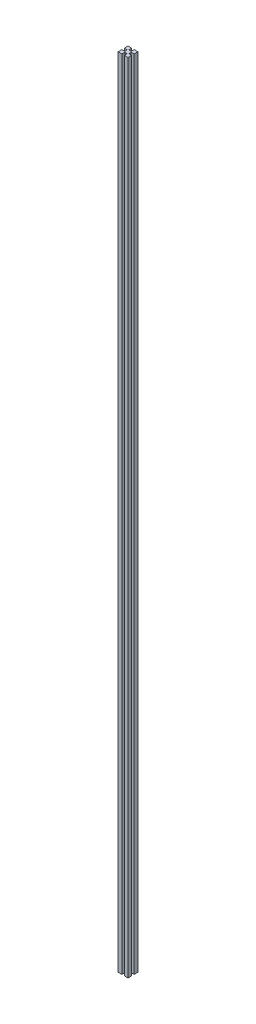
ISO-10303-21;
HEADER;
FILE_DESCRIPTION(('STEP AP214'),'2;1');
FILE_NAME('part.step','',(''),(''),'','','');
FILE_SCHEMA(('AUTOMOTIVE_DESIGN { 1 0 10303 214 1 1 1 1 }'));
ENDSEC;
DATA;
#1=APPLICATION_CONTEXT('core data for automotive mechanical design processes');
#2=APPLICATION_PROTOCOL_DEFINITION('international standard','automotive_design',2000,#1);
#3=PRODUCT_CONTEXT('',#1,'mechanical');
#4=PRODUCT('Part','Part','',(#3));
#5=PRODUCT_RELATED_PRODUCT_CATEGORY('part','',(#4));
#6=PRODUCT_DEFINITION_FORMATION('','',#4);
#7=PRODUCT_DEFINITION_CONTEXT('part definition',#1,'design');
#8=PRODUCT_DEFINITION('design','',#6,#7);
#9=PRODUCT_DEFINITION_SHAPE('','',#8);
#10=(LENGTH_UNIT() NAMED_UNIT(*) SI_UNIT(.MILLI.,.METRE.));
#11=(NAMED_UNIT(*) PLANE_ANGLE_UNIT() SI_UNIT($,.RADIAN.));
#12=(NAMED_UNIT(*) SI_UNIT($,.STERADIAN.) SOLID_ANGLE_UNIT());
#13=UNCERTAINTY_MEASURE_WITH_UNIT(LENGTH_MEASURE(1.E-05),#10,'distance_accuracy_value','');
#14=(GEOMETRIC_REPRESENTATION_CONTEXT(3) GLOBAL_UNCERTAINTY_ASSIGNED_CONTEXT((#13)) GLOBAL_UNIT_ASSIGNED_CONTEXT((#10,
#11,#12)) REPRESENTATION_CONTEXT('',''));
#15=CARTESIAN_POINT('',(0.,0.,0.));
#16=DIRECTION('',(0.,0.,1.));
#17=DIRECTION('',(1.,0.,0.));
#18=AXIS2_PLACEMENT_3D('',#15,#16,#17);
#19=CARTESIAN_POINT('',(10.,-800.1,10.));
#20=DIRECTION('',(1.,0.,0.));
#21=DIRECTION('',(0.,0.,-1.));
#22=AXIS2_PLACEMENT_3D('',#19,#20,#21);
#23=PLANE('',#22);
#24=DIRECTION('',(0.,-1.,0.));
#25=VECTOR('',#24,1.);
#26=CARTESIAN_POINT('',(10.,-800.1,2.5));
#27=LINE('',#26,#25);
#28=CARTESIAN_POINT('',(10.,800.1,2.5));
#29=VERTEX_POINT('',#28);
#30=CARTESIAN_POINT('',(10.,-800.1,2.5));
#31=VERTEX_POINT('',#30);
#32=EDGE_CURVE('E263',#29,#31,#27,.T.);
#33=ORIENTED_EDGE('',*,*,#32,.F.);
#34=DIRECTION('',(0.,0.,-1.));
#35=VECTOR('',#34,1.);
#36=CARTESIAN_POINT('',(10.,800.1,10.));
#37=LINE('',#36,#35);
#38=CARTESIAN_POINT('',(10.,800.1,10.));
#39=VERTEX_POINT('',#38);
#40=EDGE_CURVE('E269',#39,#29,#37,.T.);
#41=ORIENTED_EDGE('',*,*,#40,.F.);
#42=DIRECTION('',(0.,1.,0.));
#43=VECTOR('',#42,1.);
#44=CARTESIAN_POINT('',(10.,-800.1,10.));
#45=LINE('',#44,#43);
#46=CARTESIAN_POINT('',(10.,-800.1,10.));
#47=VERTEX_POINT('',#46);
#48=EDGE_CURVE('E300',#47,#39,#45,.T.);
#49=ORIENTED_EDGE('',*,*,#48,.F.);
#50=DIRECTION('',(0.,0.,-1.));
#51=VECTOR('',#50,1.);
#52=CARTESIAN_POINT('',(10.,-800.1,10.));
#53=LINE('',#52,#51);
#54=EDGE_CURVE('E284',#47,#31,#53,.T.);
#55=ORIENTED_EDGE('',*,*,#54,.T.);
#56=EDGE_LOOP('',(#33,#41,#49,#55));
#57=FACE_BOUND('',#56,.T.);
#58=ADVANCED_FACE('F32',(#57),#23,.T.);
#59=CARTESIAN_POINT('',(-10.,-800.1,10.));
#60=DIRECTION('',(0.,0.,1.));
#61=DIRECTION('',(1.,0.,0.));
#62=AXIS2_PLACEMENT_3D('',#59,#60,#61);
#63=PLANE('',#62);
#64=DIRECTION('',(0.,1.,0.));
#65=VECTOR('',#64,1.);
#66=CARTESIAN_POINT('',(2.5,-800.1,10.));
#67=LINE('',#66,#65);
#68=CARTESIAN_POINT('',(2.5,-800.1,10.));
#69=VERTEX_POINT('',#68);
#70=CARTESIAN_POINT('',(2.5,800.1,10.));
#71=VERTEX_POINT('',#70);
#72=EDGE_CURVE('E256',#69,#71,#67,.T.);
#73=ORIENTED_EDGE('',*,*,#72,.F.);
#74=DIRECTION('',(1.,0.,0.));
#75=VECTOR('',#74,1.);
#76=CARTESIAN_POINT('',(-10.,-800.1,10.));
#77=LINE('',#76,#75);
#78=EDGE_CURVE('E295',#69,#47,#77,.T.);
#79=ORIENTED_EDGE('',*,*,#78,.T.);
#80=ORIENTED_EDGE('',*,*,#48,.T.);
#81=DIRECTION('',(1.,0.,0.));
#82=VECTOR('',#81,1.);
#83=CARTESIAN_POINT('',(-10.,800.1,10.));
#84=LINE('',#83,#82);
#85=EDGE_CURVE('E279',#71,#39,#84,.T.);
#86=ORIENTED_EDGE('',*,*,#85,.F.);
#87=EDGE_LOOP('',(#73,#79,#80,#86));
#88=FACE_BOUND('',#87,.T.);
#89=ADVANCED_FACE('F374',(#88),#63,.T.);
#90=CARTESIAN_POINT('',(-10.,-800.1,10.));
#91=DIRECTION('',(-1.,0.,0.));
#92=DIRECTION('',(0.,0.,1.));
#93=AXIS2_PLACEMENT_3D('',#90,#91,#92);
#94=PLANE('',#93);
#95=DIRECTION('',(0.,-1.,0.));
#96=VECTOR('',#95,1.);
#97=CARTESIAN_POINT('',(-10.,-800.1,-2.5));
#98=LINE('',#97,#96);
#99=CARTESIAN_POINT('',(-10.,800.1,-2.5));
#100=VERTEX_POINT('',#99);
#101=CARTESIAN_POINT('',(-10.,-800.1,-2.5));
#102=VERTEX_POINT('',#101);
#103=EDGE_CURVE('E259',#100,#102,#98,.T.);
#104=ORIENTED_EDGE('',*,*,#103,.F.);
#105=DIRECTION('',(0.,0.,1.));
#106=VECTOR('',#105,1.);
#107=CARTESIAN_POINT('',(-10.,800.1,10.));
#108=LINE('',#107,#106);
#109=CARTESIAN_POINT('',(-10.,800.1,-10.));
#110=VERTEX_POINT('',#109);
#111=EDGE_CURVE('E276',#110,#100,#108,.T.);
#112=ORIENTED_EDGE('',*,*,#111,.F.);
#113=DIRECTION('',(0.,1.,0.));
#114=VECTOR('',#113,1.);
#115=CARTESIAN_POINT('',(-10.,-800.1,-10.));
#116=LINE('',#115,#114);
#117=CARTESIAN_POINT('',(-10.,-800.1,-10.));
#118=VERTEX_POINT('',#117);
#119=EDGE_CURVE('E307',#118,#110,#116,.T.);
#120=ORIENTED_EDGE('',*,*,#119,.F.);
#121=DIRECTION('',(0.,0.,1.));
#122=VECTOR('',#121,1.);
#123=CARTESIAN_POINT('',(-10.,-800.1,10.));
#124=LINE('',#123,#122);
#125=EDGE_CURVE('E292',#118,#102,#124,.T.);
#126=ORIENTED_EDGE('',*,*,#125,.T.);
#127=EDGE_LOOP('',(#104,#112,#120,#126));
#128=FACE_BOUND('',#127,.T.);
#129=ADVANCED_FACE('F344',(#128),#94,.T.);
#130=CARTESIAN_POINT('',(-10.,-800.1,-10.));
#131=DIRECTION('',(0.,0.,-1.));
#132=DIRECTION('',(-1.,0.,0.));
#133=AXIS2_PLACEMENT_3D('',#130,#131,#132);
#134=PLANE('',#133);
#135=DIRECTION('',(0.,-1.,0.));
#136=VECTOR('',#135,1.);
#137=CARTESIAN_POINT('',(2.5,-800.1,-10.));
#138=LINE('',#137,#136);
#139=CARTESIAN_POINT('',(2.5,800.1,-10.));
#140=VERTEX_POINT('',#139);
#141=CARTESIAN_POINT('',(2.5,-800.1,-10.));
#142=VERTEX_POINT('',#141);
#143=EDGE_CURVE('E266',#140,#142,#138,.T.);
#144=ORIENTED_EDGE('',*,*,#143,.F.);
#145=DIRECTION('',(-1.,0.,0.));
#146=VECTOR('',#145,1.);
#147=CARTESIAN_POINT('',(-10.,800.1,-10.));
#148=LINE('',#147,#146);
#149=CARTESIAN_POINT('',(10.,800.1,-10.));
#150=VERTEX_POINT('',#149);
#151=EDGE_CURVE('E273',#150,#140,#148,.T.);
#152=ORIENTED_EDGE('',*,*,#151,.F.);
#153=DIRECTION('',(0.,1.,0.));
#154=VECTOR('',#153,1.);
#155=CARTESIAN_POINT('',(10.,-800.1,-10.));
#156=LINE('',#155,#154);
#157=CARTESIAN_POINT('',(10.,-800.1,-10.));
#158=VERTEX_POINT('',#157);
#159=EDGE_CURVE('E299',#158,#150,#156,.T.);
#160=ORIENTED_EDGE('',*,*,#159,.F.);
#161=DIRECTION('',(-1.,0.,0.));
#162=VECTOR('',#161,1.);
#163=CARTESIAN_POINT('',(-10.,-800.1,-10.));
#164=LINE('',#163,#162);
#165=EDGE_CURVE('E288',#158,#142,#164,.T.);
#166=ORIENTED_EDGE('',*,*,#165,.T.);
#167=EDGE_LOOP('',(#144,#152,#160,#166));
#168=FACE_BOUND('',#167,.T.);
#169=ADVANCED_FACE('F328',(#168),#134,.T.);
#170=DIRECTION('',(0.,1.,0.));
#171=VECTOR('',#170,1.);
#172=CARTESIAN_POINT('',(10.,-800.1,-2.5));
#173=LINE('',#172,#171);
#174=CARTESIAN_POINT('',(10.,-800.1,-2.5));
#175=VERTEX_POINT('',#174);
#176=CARTESIAN_POINT('',(10.,800.1,-2.5));
#177=VERTEX_POINT('',#176);
#178=EDGE_CURVE('E261',#175,#177,#173,.T.);
#179=ORIENTED_EDGE('',*,*,#178,.F.);
#180=EDGE_CURVE('E283',#175,#158,#53,.T.);
#181=ORIENTED_EDGE('',*,*,#180,.T.);
#182=ORIENTED_EDGE('',*,*,#159,.T.);
#183=EDGE_CURVE('E268',#177,#150,#37,.T.);
#184=ORIENTED_EDGE('',*,*,#183,.F.);
#185=EDGE_LOOP('',(#179,#181,#182,#184));
#186=FACE_BOUND('',#185,.T.);
#187=ADVANCED_FACE('F34',(#186),#23,.T.);
#188=DIRECTION('',(0.,-1.,0.));
#189=VECTOR('',#188,1.);
#190=CARTESIAN_POINT('',(-2.5,-800.1,10.));
#191=LINE('',#190,#189);
#192=CARTESIAN_POINT('',(-2.5,800.1,10.));
#193=VERTEX_POINT('',#192);
#194=CARTESIAN_POINT('',(-2.5,-800.1,10.));
#195=VERTEX_POINT('',#194);
#196=EDGE_CURVE('E200',#193,#195,#191,.T.);
#197=ORIENTED_EDGE('',*,*,#196,.F.);
#198=CARTESIAN_POINT('',(-10.,800.1,10.));
#199=VERTEX_POINT('',#198);
#200=EDGE_CURVE('E280',#199,#193,#84,.T.);
#201=ORIENTED_EDGE('',*,*,#200,.F.);
#202=DIRECTION('',(0.,1.,0.));
#203=VECTOR('',#202,1.);
#204=CARTESIAN_POINT('',(-10.,-800.1,10.));
#205=LINE('',#204,#203);
#206=CARTESIAN_POINT('',(-10.,-800.1,10.));
#207=VERTEX_POINT('',#206);
#208=EDGE_CURVE('E304',#207,#199,#205,.T.);
#209=ORIENTED_EDGE('',*,*,#208,.F.);
#210=EDGE_CURVE('E296',#207,#195,#77,.T.);
#211=ORIENTED_EDGE('',*,*,#210,.T.);
#212=EDGE_LOOP('',(#197,#201,#209,#211));
#213=FACE_BOUND('',#212,.T.);
#214=ADVANCED_FACE('F360',(#213),#63,.T.);
#215=DIRECTION('',(0.,1.,0.));
#216=VECTOR('',#215,1.);
#217=CARTESIAN_POINT('',(-10.,-800.1,2.5));
#218=LINE('',#217,#216);
#219=CARTESIAN_POINT('',(-10.,-800.1,2.5));
#220=VERTEX_POINT('',#219);
#221=CARTESIAN_POINT('',(-10.,800.1,2.5));
#222=VERTEX_POINT('',#221);
#223=EDGE_CURVE('E55',#220,#222,#218,.T.);
#224=ORIENTED_EDGE('',*,*,#223,.F.);
#225=EDGE_CURVE('E291',#220,#207,#124,.T.);
#226=ORIENTED_EDGE('',*,*,#225,.T.);
#227=ORIENTED_EDGE('',*,*,#208,.T.);
#228=EDGE_CURVE('E275',#222,#199,#108,.T.);
#229=ORIENTED_EDGE('',*,*,#228,.F.);
#230=EDGE_LOOP('',(#224,#226,#227,#229));
#231=FACE_BOUND('',#230,.T.);
#232=ADVANCED_FACE('F354',(#231),#94,.T.);
#233=DIRECTION('',(0.,1.,0.));
#234=VECTOR('',#233,1.);
#235=CARTESIAN_POINT('',(-2.5,-800.1,-10.));
#236=LINE('',#235,#234);
#237=CARTESIAN_POINT('',(-2.5,-800.1,-10.));
#238=VERTEX_POINT('',#237);
#239=CARTESIAN_POINT('',(-2.5,800.1,-10.));
#240=VERTEX_POINT('',#239);
#241=EDGE_CURVE('E173',#238,#240,#236,.T.);
#242=ORIENTED_EDGE('',*,*,#241,.F.);
#243=EDGE_CURVE('E287',#238,#118,#164,.T.);
#244=ORIENTED_EDGE('',*,*,#243,.T.);
#245=ORIENTED_EDGE('',*,*,#119,.T.);
#246=EDGE_CURVE('E272',#240,#110,#148,.T.);
#247=ORIENTED_EDGE('',*,*,#246,.F.);
#248=EDGE_LOOP('',(#242,#244,#245,#247));
#249=FACE_BOUND('',#248,.T.);
#250=ADVANCED_FACE('F337',(#249),#134,.T.);
#251=CARTESIAN_POINT('',(0.,-800.1,0.));
#252=DIRECTION('',(0.,-1.,0.));
#253=DIRECTION('',(0.,0.,-1.));
#254=AXIS2_PLACEMENT_3D('',#251,#252,#253);
#255=PLANE('',#254);
#256=DIRECTION('',(0.,0.,-1.));
#257=VECTOR('',#256,1.);
#258=CARTESIAN_POINT('',(2.5,-800.1,-4.00000000000001));
#259=LINE('',#258,#257);
#260=CARTESIAN_POINT('',(2.5,-800.1,-4.00000000000001));
#261=VERTEX_POINT('',#260);
#262=EDGE_CURVE('E190',#261,#142,#259,.T.);
#263=ORIENTED_EDGE('',*,*,#262,.T.);
#264=ORIENTED_EDGE('',*,*,#165,.F.);
#265=ORIENTED_EDGE('',*,*,#180,.F.);
#266=DIRECTION('',(-1.,0.,0.));
#267=VECTOR('',#266,1.);
#268=CARTESIAN_POINT('',(4.,-800.1,-2.5));
#269=LINE('',#268,#267);
#270=CARTESIAN_POINT('',(4.,-800.1,-2.5));
#271=VERTEX_POINT('',#270);
#272=EDGE_CURVE('E208',#175,#271,#269,.T.);
#273=ORIENTED_EDGE('',*,*,#272,.T.);
#274=DIRECTION('',(0.,0.,1.));
#275=VECTOR('',#274,1.);
#276=CARTESIAN_POINT('',(4.,-800.1,-2.5));
#277=LINE('',#276,#275);
#278=CARTESIAN_POINT('',(4.,-800.1,2.5));
#279=VERTEX_POINT('',#278);
#280=EDGE_CURVE('E211',#271,#279,#277,.T.);
#281=ORIENTED_EDGE('',*,*,#280,.T.);
#282=DIRECTION('',(1.,0.,0.));
#283=VECTOR('',#282,1.);
#284=CARTESIAN_POINT('',(4.,-800.1,2.5));
#285=LINE('',#284,#283);
#286=EDGE_CURVE('E214',#279,#31,#285,.T.);
#287=ORIENTED_EDGE('',*,*,#286,.T.);
#288=ORIENTED_EDGE('',*,*,#54,.F.);
#289=ORIENTED_EDGE('',*,*,#78,.F.);
#290=DIRECTION('',(0.,0.,-1.));
#291=VECTOR('',#290,1.);
#292=CARTESIAN_POINT('',(2.5,-800.1,4.));
#293=LINE('',#292,#291);
#294=CARTESIAN_POINT('',(2.5,-800.1,4.));
#295=VERTEX_POINT('',#294);
#296=EDGE_CURVE('E249',#69,#295,#293,.T.);
#297=ORIENTED_EDGE('',*,*,#296,.T.);
#298=DIRECTION('',(-1.,0.,0.));
#299=VECTOR('',#298,1.);
#300=CARTESIAN_POINT('',(-2.5,-800.1,4.));
#301=LINE('',#300,#299);
#302=CARTESIAN_POINT('',(-2.5,-800.1,4.));
#303=VERTEX_POINT('',#302);
#304=EDGE_CURVE('E243',#295,#303,#301,.T.);
#305=ORIENTED_EDGE('',*,*,#304,.T.);
#306=DIRECTION('',(0.,0.,1.));
#307=VECTOR('',#306,1.);
#308=CARTESIAN_POINT('',(-2.5,-800.1,4.));
#309=LINE('',#308,#307);
#310=EDGE_CURVE('E246',#303,#195,#309,.T.);
#311=ORIENTED_EDGE('',*,*,#310,.T.);
#312=ORIENTED_EDGE('',*,*,#210,.F.);
#313=ORIENTED_EDGE('',*,*,#225,.F.);
#314=DIRECTION('',(1.,0.,0.));
#315=VECTOR('',#314,1.);
#316=CARTESIAN_POINT('',(-4.00000000000001,-800.1,2.5));
#317=LINE('',#316,#315);
#318=CARTESIAN_POINT('',(-4.00000000000001,-800.1,2.5));
#319=VERTEX_POINT('',#318);
#320=EDGE_CURVE('E230',#220,#319,#317,.T.);
#321=ORIENTED_EDGE('',*,*,#320,.T.);
#322=DIRECTION('',(0.,0.,-1.));
#323=VECTOR('',#322,1.);
#324=CARTESIAN_POINT('',(-4.00000000000001,-800.1,-2.5));
#325=LINE('',#324,#323);
#326=CARTESIAN_POINT('',(-4.00000000000001,-800.1,-2.5));
#327=VERTEX_POINT('',#326);
#328=EDGE_CURVE('E233',#319,#327,#325,.T.);
#329=ORIENTED_EDGE('',*,*,#328,.T.);
#330=DIRECTION('',(-1.,0.,0.));
#331=VECTOR('',#330,1.);
#332=CARTESIAN_POINT('',(-4.00000000000001,-800.1,-2.5));
#333=LINE('',#332,#331);
#334=EDGE_CURVE('E227',#327,#102,#333,.T.);
#335=ORIENTED_EDGE('',*,*,#334,.T.);
#336=ORIENTED_EDGE('',*,*,#125,.F.);
#337=ORIENTED_EDGE('',*,*,#243,.F.);
#338=DIRECTION('',(0.,0.,1.));
#339=VECTOR('',#338,1.);
#340=CARTESIAN_POINT('',(-2.5,-800.1,-4.00000000000001));
#341=LINE('',#340,#339);
#342=CARTESIAN_POINT('',(-2.5,-800.1,-4.00000000000001));
#343=VERTEX_POINT('',#342);
#344=EDGE_CURVE('E193',#238,#343,#341,.T.);
#345=ORIENTED_EDGE('',*,*,#344,.T.);
#346=DIRECTION('',(1.,0.,0.));
#347=VECTOR('',#346,1.);
#348=CARTESIAN_POINT('',(-2.5,-800.1,-4.00000000000001));
#349=LINE('',#348,#347);
#350=EDGE_CURVE('E183',#343,#261,#349,.T.);
#351=ORIENTED_EDGE('',*,*,#350,.T.);
#352=EDGE_LOOP('',(#263,#264,#265,#273,#281,#287,#288,#289,#297,#305,#311,#312,#313,#321,#329,
#335,#336,#337,#345,#351));
#353=FACE_BOUND('',#352,.T.);
#354=ADVANCED_FACE('F333',(#353),#255,.T.);
#355=CARTESIAN_POINT('',(0.,800.1,0.));
#356=DIRECTION('',(0.,-1.,0.));
#357=DIRECTION('',(0.,0.,-1.));
#358=AXIS2_PLACEMENT_3D('',#355,#356,#357);
#359=PLANE('',#358);
#360=ORIENTED_EDGE('',*,*,#151,.T.);
#361=DIRECTION('',(0.,0.,-1.));
#362=VECTOR('',#361,1.);
#363=CARTESIAN_POINT('',(2.5,800.1,-4.00000000000001));
#364=LINE('',#363,#362);
#365=CARTESIAN_POINT('',(2.5,800.1,-4.00000000000001));
#366=VERTEX_POINT('',#365);
#367=EDGE_CURVE('E189',#366,#140,#364,.T.);
#368=ORIENTED_EDGE('',*,*,#367,.F.);
#369=DIRECTION('',(1.,0.,0.));
#370=VECTOR('',#369,1.);
#371=CARTESIAN_POINT('',(-2.5,800.1,-4.00000000000001));
#372=LINE('',#371,#370);
#373=CARTESIAN_POINT('',(-2.5,800.1,-4.00000000000001));
#374=VERTEX_POINT('',#373);
#375=EDGE_CURVE('E180',#374,#366,#372,.T.);
#376=ORIENTED_EDGE('',*,*,#375,.F.);
#377=DIRECTION('',(0.,0.,-1.));
#378=VECTOR('',#377,1.);
#379=CARTESIAN_POINT('',(-2.5,800.1,0.));
#380=LINE('',#379,#378);
#381=EDGE_CURVE('E11',#374,#240,#380,.T.);
#382=ORIENTED_EDGE('',*,*,#381,.T.);
#383=ORIENTED_EDGE('',*,*,#246,.T.);
#384=ORIENTED_EDGE('',*,*,#111,.T.);
#385=DIRECTION('',(-1.,0.,0.));
#386=VECTOR('',#385,1.);
#387=CARTESIAN_POINT('',(-4.00000000000001,800.1,-2.5));
#388=LINE('',#387,#386);
#389=CARTESIAN_POINT('',(-4.00000000000001,800.1,-2.5));
#390=VERTEX_POINT('',#389);
#391=EDGE_CURVE('E221',#390,#100,#388,.T.);
#392=ORIENTED_EDGE('',*,*,#391,.F.);
#393=DIRECTION('',(0.,0.,-1.));
#394=VECTOR('',#393,1.);
#395=CARTESIAN_POINT('',(-4.00000000000001,800.1,-2.5));
#396=LINE('',#395,#394);
#397=CARTESIAN_POINT('',(-4.00000000000001,800.1,2.5));
#398=VERTEX_POINT('',#397);
#399=EDGE_CURVE('E223',#398,#390,#396,.T.);
#400=ORIENTED_EDGE('',*,*,#399,.F.);
#401=DIRECTION('',(-1.,0.,0.));
#402=VECTOR('',#401,1.);
#403=CARTESIAN_POINT('',(0.,800.1,2.5));
#404=LINE('',#403,#402);
#405=EDGE_CURVE('E314',#398,#222,#404,.T.);
#406=ORIENTED_EDGE('',*,*,#405,.T.);
#407=ORIENTED_EDGE('',*,*,#228,.T.);
#408=ORIENTED_EDGE('',*,*,#200,.T.);
#409=DIRECTION('',(0.,0.,1.));
#410=VECTOR('',#409,1.);
#411=CARTESIAN_POINT('',(-2.5,800.1,4.));
#412=LINE('',#411,#410);
#413=CARTESIAN_POINT('',(-2.5,800.1,4.));
#414=VERTEX_POINT('',#413);
#415=EDGE_CURVE('E241',#414,#193,#412,.T.);
#416=ORIENTED_EDGE('',*,*,#415,.F.);
#417=DIRECTION('',(-1.,0.,0.));
#418=VECTOR('',#417,1.);
#419=CARTESIAN_POINT('',(-2.5,800.1,4.));
#420=LINE('',#419,#418);
#421=CARTESIAN_POINT('',(2.5,800.1,4.));
#422=VERTEX_POINT('',#421);
#423=EDGE_CURVE('E47',#422,#414,#420,.T.);
#424=ORIENTED_EDGE('',*,*,#423,.F.);
#425=DIRECTION('',(0.,0.,1.));
#426=VECTOR('',#425,1.);
#427=CARTESIAN_POINT('',(2.5,800.1,0.));
#428=LINE('',#427,#426);
#429=EDGE_CURVE('E303',#422,#71,#428,.T.);
#430=ORIENTED_EDGE('',*,*,#429,.T.);
#431=ORIENTED_EDGE('',*,*,#85,.T.);
#432=ORIENTED_EDGE('',*,*,#40,.T.);
#433=DIRECTION('',(1.,0.,0.));
#434=VECTOR('',#433,1.);
#435=CARTESIAN_POINT('',(4.,800.1,2.5));
#436=LINE('',#435,#434);
#437=CARTESIAN_POINT('',(4.,800.1,2.5));
#438=VERTEX_POINT('',#437);
#439=EDGE_CURVE('E205',#438,#29,#436,.T.);
#440=ORIENTED_EDGE('',*,*,#439,.F.);
#441=DIRECTION('',(0.,0.,1.));
#442=VECTOR('',#441,1.);
#443=CARTESIAN_POINT('',(4.,800.1,-2.5));
#444=LINE('',#443,#442);
#445=CARTESIAN_POINT('',(4.,800.1,-2.5));
#446=VERTEX_POINT('',#445);
#447=EDGE_CURVE('E202',#446,#438,#444,.T.);
#448=ORIENTED_EDGE('',*,*,#447,.F.);
#449=DIRECTION('',(1.,0.,0.));
#450=VECTOR('',#449,1.);
#451=CARTESIAN_POINT('',(0.,800.1,-2.5));
#452=LINE('',#451,#450);
#453=EDGE_CURVE('E40',#446,#177,#452,.T.);
#454=ORIENTED_EDGE('',*,*,#453,.T.);
#455=ORIENTED_EDGE('',*,*,#183,.T.);
#456=EDGE_LOOP('',(#360,#368,#376,#382,#383,#384,#392,#400,#406,#407,#408,#416,#424,#430,#431,
#432,#440,#448,#454,#455));
#457=FACE_BOUND('',#456,.T.);
#458=ADVANCED_FACE('F188',(#457),#359,.F.);
#459=CARTESIAN_POINT('',(-2.5,-800.1,4.));
#460=DIRECTION('',(0.,0.,-1.));
#461=DIRECTION('',(-1.,0.,0.));
#462=AXIS2_PLACEMENT_3D('',#459,#460,#461);
#463=PLANE('',#462);
#464=DIRECTION('',(0.,1.,0.));
#465=VECTOR('',#464,1.);
#466=CARTESIAN_POINT('',(-2.5,-800.1,4.));
#467=LINE('',#466,#465);
#468=EDGE_CURVE('E252',#303,#414,#467,.T.);
#469=ORIENTED_EDGE('',*,*,#468,.F.);
#470=ORIENTED_EDGE('',*,*,#304,.F.);
#471=DIRECTION('',(0.,1.,0.));
#472=VECTOR('',#471,1.);
#473=CARTESIAN_POINT('',(2.5,-800.1,4.));
#474=LINE('',#473,#472);
#475=EDGE_CURVE('E224',#295,#422,#474,.T.);
#476=ORIENTED_EDGE('',*,*,#475,.T.);
#477=ORIENTED_EDGE('',*,*,#423,.T.);
#478=EDGE_LOOP('',(#469,#470,#476,#477));
#479=FACE_BOUND('',#478,.T.);
#480=ADVANCED_FACE('F366',(#479),#463,.F.);
#481=CARTESIAN_POINT('',(2.5,-800.1,4.));
#482=DIRECTION('',(1.,0.,0.));
#483=DIRECTION('',(0.,0.,-1.));
#484=AXIS2_PLACEMENT_3D('',#481,#482,#483);
#485=PLANE('',#484);
#486=ORIENTED_EDGE('',*,*,#72,.T.);
#487=ORIENTED_EDGE('',*,*,#429,.F.);
#488=ORIENTED_EDGE('',*,*,#475,.F.);
#489=ORIENTED_EDGE('',*,*,#296,.F.);
#490=EDGE_LOOP('',(#486,#487,#488,#489));
#491=FACE_BOUND('',#490,.T.);
#492=ADVANCED_FACE('F371',(#491),#485,.F.);
#493=CARTESIAN_POINT('',(-2.5,-800.1,4.));
#494=DIRECTION('',(-1.,0.,0.));
#495=DIRECTION('',(0.,0.,1.));
#496=AXIS2_PLACEMENT_3D('',#493,#494,#495);
#497=PLANE('',#496);
#498=ORIENTED_EDGE('',*,*,#196,.T.);
#499=ORIENTED_EDGE('',*,*,#310,.F.);
#500=ORIENTED_EDGE('',*,*,#468,.T.);
#501=ORIENTED_EDGE('',*,*,#415,.T.);
#502=EDGE_LOOP('',(#498,#499,#500,#501));
#503=FACE_BOUND('',#502,.T.);
#504=ADVANCED_FACE('F363',(#503),#497,.F.);
#505=CARTESIAN_POINT('',(-4.00000000000001,-800.1,-2.5));
#506=DIRECTION('',(0.,0.,-1.));
#507=DIRECTION('',(-1.,0.,0.));
#508=AXIS2_PLACEMENT_3D('',#505,#506,#507);
#509=PLANE('',#508);
#510=ORIENTED_EDGE('',*,*,#103,.T.);
#511=ORIENTED_EDGE('',*,*,#334,.F.);
#512=DIRECTION('',(0.,1.,0.));
#513=VECTOR('',#512,1.);
#514=CARTESIAN_POINT('',(-4.00000000000001,-800.1,-2.5));
#515=LINE('',#514,#513);
#516=EDGE_CURVE('E206',#327,#390,#515,.T.);
#517=ORIENTED_EDGE('',*,*,#516,.T.);
#518=ORIENTED_EDGE('',*,*,#391,.T.);
#519=EDGE_LOOP('',(#510,#511,#517,#518));
#520=FACE_BOUND('',#519,.T.);
#521=ADVANCED_FACE('F347',(#520),#509,.F.);
#522=CARTESIAN_POINT('',(-4.00000000000001,-800.1,-2.5));
#523=DIRECTION('',(1.,0.,0.));
#524=DIRECTION('',(0.,0.,-1.));
#525=AXIS2_PLACEMENT_3D('',#522,#523,#524);
#526=PLANE('',#525);
#527=ORIENTED_EDGE('',*,*,#516,.F.);
#528=ORIENTED_EDGE('',*,*,#328,.F.);
#529=DIRECTION('',(0.,1.,0.));
#530=VECTOR('',#529,1.);
#531=CARTESIAN_POINT('',(-4.00000000000001,-800.1,2.5));
#532=LINE('',#531,#530);
#533=EDGE_CURVE('E236',#319,#398,#532,.T.);
#534=ORIENTED_EDGE('',*,*,#533,.T.);
#535=ORIENTED_EDGE('',*,*,#399,.T.);
#536=EDGE_LOOP('',(#527,#528,#534,#535));
#537=FACE_BOUND('',#536,.T.);
#538=ADVANCED_FACE('F351',(#537),#526,.F.);
#539=CARTESIAN_POINT('',(-4.00000000000001,-800.1,2.5));
#540=DIRECTION('',(0.,0.,1.));
#541=DIRECTION('',(1.,0.,0.));
#542=AXIS2_PLACEMENT_3D('',#539,#540,#541);
#543=PLANE('',#542);
#544=ORIENTED_EDGE('',*,*,#223,.T.);
#545=ORIENTED_EDGE('',*,*,#405,.F.);
#546=ORIENTED_EDGE('',*,*,#533,.F.);
#547=ORIENTED_EDGE('',*,*,#320,.F.);
#548=EDGE_LOOP('',(#544,#545,#546,#547));
#549=FACE_BOUND('',#548,.T.);
#550=ADVANCED_FACE('F428',(#549),#543,.F.);
#551=CARTESIAN_POINT('',(4.,-800.1,2.5));
#552=DIRECTION('',(0.,0.,1.));
#553=DIRECTION('',(1.,0.,0.));
#554=AXIS2_PLACEMENT_3D('',#551,#552,#553);
#555=PLANE('',#554);
#556=ORIENTED_EDGE('',*,*,#32,.T.);
#557=ORIENTED_EDGE('',*,*,#286,.F.);
#558=DIRECTION('',(0.,1.,0.));
#559=VECTOR('',#558,1.);
#560=CARTESIAN_POINT('',(4.,-800.1,2.5));
#561=LINE('',#560,#559);
#562=EDGE_CURVE('E195',#279,#438,#561,.T.);
#563=ORIENTED_EDGE('',*,*,#562,.T.);
#564=ORIENTED_EDGE('',*,*,#439,.T.);
#565=EDGE_LOOP('',(#556,#557,#563,#564));
#566=FACE_BOUND('',#565,.T.);
#567=ADVANCED_FACE('F381',(#566),#555,.F.);
#568=CARTESIAN_POINT('',(4.,-800.1,-2.5));
#569=DIRECTION('',(-1.,0.,0.));
#570=DIRECTION('',(0.,0.,1.));
#571=AXIS2_PLACEMENT_3D('',#568,#569,#570);
#572=PLANE('',#571);
#573=ORIENTED_EDGE('',*,*,#562,.F.);
#574=ORIENTED_EDGE('',*,*,#280,.F.);
#575=DIRECTION('',(0.,1.,0.));
#576=VECTOR('',#575,1.);
#577=CARTESIAN_POINT('',(4.,-800.1,-2.5));
#578=LINE('',#577,#576);
#579=EDGE_CURVE('E217',#271,#446,#578,.T.);
#580=ORIENTED_EDGE('',*,*,#579,.T.);
#581=ORIENTED_EDGE('',*,*,#447,.T.);
#582=EDGE_LOOP('',(#573,#574,#580,#581));
#583=FACE_BOUND('',#582,.T.);
#584=ADVANCED_FACE('F384',(#583),#572,.F.);
#585=CARTESIAN_POINT('',(4.,-800.1,-2.5));
#586=DIRECTION('',(0.,0.,-1.));
#587=DIRECTION('',(-1.,0.,0.));
#588=AXIS2_PLACEMENT_3D('',#585,#586,#587);
#589=PLANE('',#588);
#590=ORIENTED_EDGE('',*,*,#178,.T.);
#591=ORIENTED_EDGE('',*,*,#453,.F.);
#592=ORIENTED_EDGE('',*,*,#579,.F.);
#593=ORIENTED_EDGE('',*,*,#272,.F.);
#594=EDGE_LOOP('',(#590,#591,#592,#593));
#595=FACE_BOUND('',#594,.T.);
#596=ADVANCED_FACE('F385',(#595),#589,.F.);
#597=CARTESIAN_POINT('',(2.5,-800.1,-4.00000000000001));
#598=DIRECTION('',(1.,0.,0.));
#599=DIRECTION('',(0.,0.,-1.));
#600=AXIS2_PLACEMENT_3D('',#597,#598,#599);
#601=PLANE('',#600);
#602=ORIENTED_EDGE('',*,*,#143,.T.);
#603=ORIENTED_EDGE('',*,*,#262,.F.);
#604=DIRECTION('',(0.,1.,0.));
#605=VECTOR('',#604,1.);
#606=CARTESIAN_POINT('',(2.5,-800.1,-4.00000000000001));
#607=LINE('',#606,#605);
#608=EDGE_CURVE('E185',#261,#366,#607,.T.);
#609=ORIENTED_EDGE('',*,*,#608,.T.);
#610=ORIENTED_EDGE('',*,*,#367,.T.);
#611=EDGE_LOOP('',(#602,#603,#609,#610));
#612=FACE_BOUND('',#611,.T.);
#613=ADVANCED_FACE('F331',(#612),#601,.F.);
#614=CARTESIAN_POINT('',(-2.5,-800.1,-4.00000000000001));
#615=DIRECTION('',(0.,0.,1.));
#616=DIRECTION('',(1.,0.,0.));
#617=AXIS2_PLACEMENT_3D('',#614,#615,#616);
#618=PLANE('',#617);
#619=ORIENTED_EDGE('',*,*,#608,.F.);
#620=ORIENTED_EDGE('',*,*,#350,.F.);
#621=DIRECTION('',(0.,1.,0.));
#622=VECTOR('',#621,1.);
#623=CARTESIAN_POINT('',(-2.5,-800.1,-4.00000000000001));
#624=LINE('',#623,#622);
#625=EDGE_CURVE('E170',#343,#374,#624,.T.);
#626=ORIENTED_EDGE('',*,*,#625,.T.);
#627=ORIENTED_EDGE('',*,*,#375,.T.);
#628=EDGE_LOOP('',(#619,#620,#626,#627));
#629=FACE_BOUND('',#628,.T.);
#630=ADVANCED_FACE('F179',(#629),#618,.F.);
#631=CARTESIAN_POINT('',(-2.5,-800.1,-4.00000000000001));
#632=DIRECTION('',(-1.,0.,0.));
#633=DIRECTION('',(0.,0.,1.));
#634=AXIS2_PLACEMENT_3D('',#631,#632,#633);
#635=PLANE('',#634);
#636=ORIENTED_EDGE('',*,*,#241,.T.);
#637=ORIENTED_EDGE('',*,*,#381,.F.);
#638=ORIENTED_EDGE('',*,*,#625,.F.);
#639=ORIENTED_EDGE('',*,*,#344,.F.);
#640=EDGE_LOOP('',(#636,#637,#638,#639));
#641=FACE_BOUND('',#640,.T.);
#642=ADVANCED_FACE('F169',(#641),#635,.F.);
#643=CLOSED_SHELL('',(#58,#89,#129,#169,#187,#214,#232,#250,#354,#458,#480,#492,#504,#521,#538,
#550,#567,#584,#596,#613,#630,#642));
#644=MANIFOLD_SOLID_BREP('B2',#643);
#645=ADVANCED_BREP_SHAPE_REPRESENTATION('',(#18,#644),#14);
#646=SHAPE_DEFINITION_REPRESENTATION(#9,#645);
ENDSEC;
END-ISO-10303-21;
